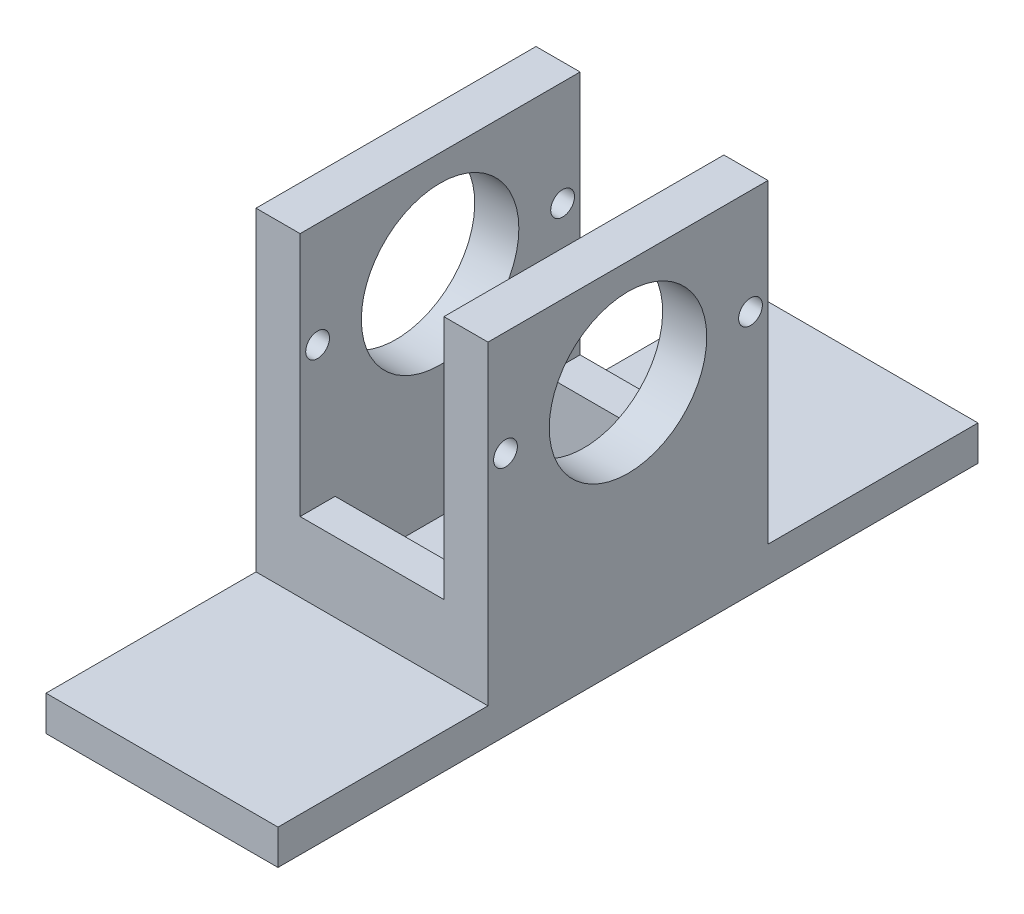
ISO-10303-21;
HEADER;
FILE_DESCRIPTION(('STEP AP214'),'2;1');
FILE_NAME('part.step','',(''),(''),'','','');
FILE_SCHEMA(('AUTOMOTIVE_DESIGN { 1 0 10303 214 1 1 1 1 }'));
ENDSEC;
DATA;
#1=APPLICATION_CONTEXT('core data for automotive mechanical design processes');
#2=APPLICATION_PROTOCOL_DEFINITION('international standard','automotive_design',2000,#1);
#3=PRODUCT_CONTEXT('',#1,'mechanical');
#4=PRODUCT('Part','Part','',(#3));
#5=PRODUCT_RELATED_PRODUCT_CATEGORY('part','',(#4));
#6=PRODUCT_DEFINITION_FORMATION('','',#4);
#7=PRODUCT_DEFINITION_CONTEXT('part definition',#1,'design');
#8=PRODUCT_DEFINITION('design','',#6,#7);
#9=PRODUCT_DEFINITION_SHAPE('','',#8);
#10=(LENGTH_UNIT() NAMED_UNIT(*) SI_UNIT(.MILLI.,.METRE.));
#11=(NAMED_UNIT(*) PLANE_ANGLE_UNIT() SI_UNIT($,.RADIAN.));
#12=(NAMED_UNIT(*) SI_UNIT($,.STERADIAN.) SOLID_ANGLE_UNIT());
#13=UNCERTAINTY_MEASURE_WITH_UNIT(LENGTH_MEASURE(1.E-05),#10,'distance_accuracy_value','');
#14=(GEOMETRIC_REPRESENTATION_CONTEXT(3) GLOBAL_UNCERTAINTY_ASSIGNED_CONTEXT((#13)) GLOBAL_UNIT_ASSIGNED_CONTEXT((#10,
#11,#12)) REPRESENTATION_CONTEXT('',''));
#15=CARTESIAN_POINT('',(0.,0.,0.));
#16=DIRECTION('',(0.,0.,1.));
#17=DIRECTION('',(1.,0.,0.));
#18=AXIS2_PLACEMENT_3D('',#15,#16,#17);
#19=CARTESIAN_POINT('',(13.0429,6.35,25.4));
#20=DIRECTION('',(1.,0.,0.));
#21=DIRECTION('',(0.,1.,0.));
#22=AXIS2_PLACEMENT_3D('',#19,#20,#21);
#23=PLANE('',#22);
#24=CARTESIAN_POINT('',(13.0429,44.45,0.));
#25=DIRECTION('',(1.,0.,0.));
#26=DIRECTION('',(0.,1.,0.));
#27=AXIS2_PLACEMENT_3D('',#24,#25,#26);
#28=CIRCLE('',#27,14.2875);
#29=CARTESIAN_POINT('',(13.0429,58.7375,0.));
#30=VERTEX_POINT('',#29);
#31=EDGE_CURVE('E243',#30,#30,#28,.T.);
#32=ORIENTED_EDGE('',*,*,#31,.T.);
#33=EDGE_LOOP('',(#32));
#34=FACE_BOUND('',#33,.T.);
#35=CARTESIAN_POINT('',(13.0429,44.45,-22.225));
#36=DIRECTION('',(1.,0.,0.));
#37=DIRECTION('',(0.,1.,0.));
#38=AXIS2_PLACEMENT_3D('',#35,#36,#37);
#39=CIRCLE('',#38,2.159);
#40=CARTESIAN_POINT('',(13.0429,46.609,-22.225));
#41=VERTEX_POINT('',#40);
#42=EDGE_CURVE('E250',#41,#41,#39,.T.);
#43=ORIENTED_EDGE('',*,*,#42,.T.);
#44=EDGE_LOOP('',(#43));
#45=FACE_BOUND('',#44,.T.);
#46=CARTESIAN_POINT('',(13.0429,44.45,22.225));
#47=DIRECTION('',(1.,0.,0.));
#48=DIRECTION('',(0.,1.,0.));
#49=AXIS2_PLACEMENT_3D('',#46,#47,#48);
#50=CIRCLE('',#49,2.159);
#51=CARTESIAN_POINT('',(13.0429,46.609,22.225));
#52=VERTEX_POINT('',#51);
#53=EDGE_CURVE('E257',#52,#52,#50,.T.);
#54=ORIENTED_EDGE('',*,*,#53,.T.);
#55=EDGE_LOOP('',(#54));
#56=FACE_BOUND('',#55,.T.);
#57=DIRECTION('',(0.,0.,1.));
#58=VECTOR('',#57,1.);
#59=CARTESIAN_POINT('',(13.0429,19.05,19.05));
#60=LINE('',#59,#58);
#61=CARTESIAN_POINT('',(13.0429,19.05,19.05));
#62=VERTEX_POINT('',#61);
#63=CARTESIAN_POINT('',(13.0429,19.05,25.4));
#64=VERTEX_POINT('',#63);
#65=EDGE_CURVE('E169',#62,#64,#60,.T.);
#66=ORIENTED_EDGE('',*,*,#65,.T.);
#67=DIRECTION('',(0.,-1.,0.));
#68=VECTOR('',#67,1.);
#69=CARTESIAN_POINT('',(13.0429,6.35,25.4));
#70=LINE('',#69,#68);
#71=CARTESIAN_POINT('',(13.0429,63.5,25.4));
#72=VERTEX_POINT('',#71);
#73=EDGE_CURVE('E272',#72,#64,#70,.T.);
#74=ORIENTED_EDGE('',*,*,#73,.F.);
#75=DIRECTION('',(0.,0.,-1.));
#76=VECTOR('',#75,1.);
#77=CARTESIAN_POINT('',(13.0429,63.5,25.4));
#78=LINE('',#77,#76);
#79=CARTESIAN_POINT('',(13.0429,63.5,-25.4));
#80=VERTEX_POINT('',#79);
#81=EDGE_CURVE('E298',#72,#80,#78,.T.);
#82=ORIENTED_EDGE('',*,*,#81,.T.);
#83=DIRECTION('',(0.,-1.,0.));
#84=VECTOR('',#83,1.);
#85=CARTESIAN_POINT('',(13.0429,6.35,-25.4));
#86=LINE('',#85,#84);
#87=CARTESIAN_POINT('',(13.0429,19.05,-25.4));
#88=VERTEX_POINT('',#87);
#89=EDGE_CURVE('E285',#80,#88,#86,.T.);
#90=ORIENTED_EDGE('',*,*,#89,.T.);
#91=DIRECTION('',(0.,0.,-1.));
#92=VECTOR('',#91,1.);
#93=CARTESIAN_POINT('',(13.0429,19.05,-19.05));
#94=LINE('',#93,#92);
#95=CARTESIAN_POINT('',(13.0429,19.05,-19.05));
#96=VERTEX_POINT('',#95);
#97=EDGE_CURVE('E67',#96,#88,#94,.T.);
#98=ORIENTED_EDGE('',*,*,#97,.F.);
#99=DIRECTION('',(0.,-1.,0.));
#100=VECTOR('',#99,1.);
#101=CARTESIAN_POINT('',(13.0429,6.35,-19.05));
#102=LINE('',#101,#100);
#103=CARTESIAN_POINT('',(13.0429,6.35,-19.05));
#104=VERTEX_POINT('',#103);
#105=EDGE_CURVE('E184',#96,#104,#102,.T.);
#106=ORIENTED_EDGE('',*,*,#105,.T.);
#107=DIRECTION('',(0.,0.,-1.));
#108=VECTOR('',#107,1.);
#109=CARTESIAN_POINT('',(13.0429,6.35,25.4));
#110=LINE('',#109,#108);
#111=CARTESIAN_POINT('',(13.0429,6.35,19.05));
#112=VERTEX_POINT('',#111);
#113=EDGE_CURVE('E176',#112,#104,#110,.T.);
#114=ORIENTED_EDGE('',*,*,#113,.F.);
#115=DIRECTION('',(0.,-1.,0.));
#116=VECTOR('',#115,1.);
#117=CARTESIAN_POINT('',(13.0429,6.35,19.05));
#118=LINE('',#117,#116);
#119=EDGE_CURVE('E161',#62,#112,#118,.T.);
#120=ORIENTED_EDGE('',*,*,#119,.F.);
#121=EDGE_LOOP('',(#66,#74,#82,#90,#98,#106,#114,#120));
#122=FACE_BOUND('',#121,.T.);
#123=ADVANCED_FACE('F44',(#34,#45,#56,#122),#23,.F.);
#124=CARTESIAN_POINT('',(-13.0429,6.35,25.4));
#125=DIRECTION('',(0.,-1.,0.));
#126=DIRECTION('',(1.,0.,0.));
#127=AXIS2_PLACEMENT_3D('',#124,#125,#126);
#128=PLANE('',#127);
#129=DIRECTION('',(-1.,0.,0.));
#130=VECTOR('',#129,1.);
#131=CARTESIAN_POINT('',(0.,6.35,25.4));
#132=LINE('',#131,#130);
#133=CARTESIAN_POINT('',(21.0439,6.35,25.4));
#134=VERTEX_POINT('',#133);
#135=CARTESIAN_POINT('',(-21.0439,6.34999999999999,25.4));
#136=VERTEX_POINT('',#135);
#137=EDGE_CURVE('E231',#134,#136,#132,.T.);
#138=ORIENTED_EDGE('',*,*,#137,.T.);
#139=DIRECTION('',(0.,0.,1.));
#140=VECTOR('',#139,1.);
#141=CARTESIAN_POINT('',(-21.0439,6.34999999999999,63.5));
#142=LINE('',#141,#140);
#143=CARTESIAN_POINT('',(-21.0439,6.34999999999999,63.5));
#144=VERTEX_POINT('',#143);
#145=EDGE_CURVE('E212',#136,#144,#142,.T.);
#146=ORIENTED_EDGE('',*,*,#145,.T.);
#147=DIRECTION('',(1.,0.,0.));
#148=VECTOR('',#147,1.);
#149=CARTESIAN_POINT('',(21.0439,6.34999999999999,63.5));
#150=LINE('',#149,#148);
#151=CARTESIAN_POINT('',(21.0439,6.34999999999999,63.5));
#152=VERTEX_POINT('',#151);
#153=EDGE_CURVE('E209',#144,#152,#150,.T.);
#154=ORIENTED_EDGE('',*,*,#153,.T.);
#155=DIRECTION('',(0.,0.,1.));
#156=VECTOR('',#155,1.);
#157=CARTESIAN_POINT('',(21.0439,6.34999999999999,63.5));
#158=LINE('',#157,#156);
#159=EDGE_CURVE('E204',#134,#152,#158,.T.);
#160=ORIENTED_EDGE('',*,*,#159,.F.);
#161=EDGE_LOOP('',(#138,#146,#154,#160));
#162=FACE_BOUND('',#161,.T.);
#163=ADVANCED_FACE('F338',(#162),#128,.F.);
#164=CARTESIAN_POINT('',(-13.0429,63.5,25.4));
#165=DIRECTION('',(-1.,0.,0.));
#166=DIRECTION('',(0.,-1.,0.));
#167=AXIS2_PLACEMENT_3D('',#164,#165,#166);
#168=PLANE('',#167);
#169=CARTESIAN_POINT('',(-13.0429,44.45,0.));
#170=DIRECTION('',(-1.,0.,0.));
#171=DIRECTION('',(0.,-1.,0.));
#172=AXIS2_PLACEMENT_3D('',#169,#170,#171);
#173=CIRCLE('',#172,14.2875);
#174=CARTESIAN_POINT('',(-13.0429,30.1625,0.));
#175=VERTEX_POINT('',#174);
#176=EDGE_CURVE('E242',#175,#175,#173,.T.);
#177=ORIENTED_EDGE('',*,*,#176,.T.);
#178=EDGE_LOOP('',(#177));
#179=FACE_BOUND('',#178,.T.);
#180=CARTESIAN_POINT('',(-13.0429,44.45,-22.225));
#181=DIRECTION('',(-1.,0.,0.));
#182=DIRECTION('',(0.,-1.,0.));
#183=AXIS2_PLACEMENT_3D('',#180,#181,#182);
#184=CIRCLE('',#183,2.159);
#185=CARTESIAN_POINT('',(-13.0429,42.291,-22.225));
#186=VERTEX_POINT('',#185);
#187=EDGE_CURVE('E249',#186,#186,#184,.T.);
#188=ORIENTED_EDGE('',*,*,#187,.T.);
#189=EDGE_LOOP('',(#188));
#190=FACE_BOUND('',#189,.T.);
#191=CARTESIAN_POINT('',(-13.0429,44.45,22.225));
#192=DIRECTION('',(-1.,0.,0.));
#193=DIRECTION('',(0.,-1.,0.));
#194=AXIS2_PLACEMENT_3D('',#191,#192,#193);
#195=CIRCLE('',#194,2.159);
#196=CARTESIAN_POINT('',(-13.0429,42.291,22.225));
#197=VERTEX_POINT('',#196);
#198=EDGE_CURVE('E256',#197,#197,#195,.T.);
#199=ORIENTED_EDGE('',*,*,#198,.T.);
#200=EDGE_LOOP('',(#199));
#201=FACE_BOUND('',#200,.T.);
#202=DIRECTION('',(0.,0.,1.));
#203=VECTOR('',#202,1.);
#204=CARTESIAN_POINT('',(-13.0429,19.05,19.05));
#205=LINE('',#204,#203);
#206=CARTESIAN_POINT('',(-13.0429,19.05,19.05));
#207=VERTEX_POINT('',#206);
#208=CARTESIAN_POINT('',(-13.0429,19.05,25.4));
#209=VERTEX_POINT('',#208);
#210=EDGE_CURVE('E172',#207,#209,#205,.T.);
#211=ORIENTED_EDGE('',*,*,#210,.F.);
#212=DIRECTION('',(0.,1.,0.));
#213=VECTOR('',#212,1.);
#214=CARTESIAN_POINT('',(-13.0429,6.35,19.05));
#215=LINE('',#214,#213);
#216=CARTESIAN_POINT('',(-13.0429,6.35,19.05));
#217=VERTEX_POINT('',#216);
#218=EDGE_CURVE('E164',#217,#207,#215,.T.);
#219=ORIENTED_EDGE('',*,*,#218,.F.);
#220=DIRECTION('',(0.,0.,-1.));
#221=VECTOR('',#220,1.);
#222=CARTESIAN_POINT('',(-13.0429,6.35,25.4));
#223=LINE('',#222,#221);
#224=CARTESIAN_POINT('',(-13.0429,6.35,-19.05));
#225=VERTEX_POINT('',#224);
#226=EDGE_CURVE('E295',#217,#225,#223,.T.);
#227=ORIENTED_EDGE('',*,*,#226,.T.);
#228=DIRECTION('',(0.,1.,0.));
#229=VECTOR('',#228,1.);
#230=CARTESIAN_POINT('',(-13.0429,6.35,-19.05));
#231=LINE('',#230,#229);
#232=CARTESIAN_POINT('',(-13.0429,19.05,-19.05));
#233=VERTEX_POINT('',#232);
#234=EDGE_CURVE('E189',#225,#233,#231,.T.);
#235=ORIENTED_EDGE('',*,*,#234,.T.);
#236=DIRECTION('',(0.,0.,-1.));
#237=VECTOR('',#236,1.);
#238=CARTESIAN_POINT('',(-13.0429,19.05,-19.05));
#239=LINE('',#238,#237);
#240=CARTESIAN_POINT('',(-13.0429,19.05,-25.4));
#241=VERTEX_POINT('',#240);
#242=EDGE_CURVE('E194',#233,#241,#239,.T.);
#243=ORIENTED_EDGE('',*,*,#242,.T.);
#244=DIRECTION('',(0.,1.,0.));
#245=VECTOR('',#244,1.);
#246=CARTESIAN_POINT('',(-13.0429,63.5,-25.4));
#247=LINE('',#246,#245);
#248=CARTESIAN_POINT('',(-13.0429,63.5,-25.4));
#249=VERTEX_POINT('',#248);
#250=EDGE_CURVE('E287',#241,#249,#247,.T.);
#251=ORIENTED_EDGE('',*,*,#250,.T.);
#252=DIRECTION('',(0.,0.,-1.));
#253=VECTOR('',#252,1.);
#254=CARTESIAN_POINT('',(-13.0429,63.5,25.4));
#255=LINE('',#254,#253);
#256=CARTESIAN_POINT('',(-13.0429,63.5,25.4));
#257=VERTEX_POINT('',#256);
#258=EDGE_CURVE('E292',#257,#249,#255,.T.);
#259=ORIENTED_EDGE('',*,*,#258,.F.);
#260=DIRECTION('',(0.,1.,0.));
#261=VECTOR('',#260,1.);
#262=CARTESIAN_POINT('',(-13.0429,63.5,25.4));
#263=LINE('',#262,#261);
#264=EDGE_CURVE('E274',#209,#257,#263,.T.);
#265=ORIENTED_EDGE('',*,*,#264,.F.);
#266=EDGE_LOOP('',(#211,#219,#227,#235,#243,#251,#259,#265));
#267=FACE_BOUND('',#266,.T.);
#268=ADVANCED_FACE('F313',(#179,#190,#201,#267),#168,.F.);
#269=DIRECTION('',(-1.,0.,0.));
#270=VECTOR('',#269,1.);
#271=CARTESIAN_POINT('',(0.,6.35,-25.4));
#272=LINE('',#271,#270);
#273=CARTESIAN_POINT('',(21.0439,6.34999999999999,-25.4));
#274=VERTEX_POINT('',#273);
#275=CARTESIAN_POINT('',(-21.0439,6.35,-25.4));
#276=VERTEX_POINT('',#275);
#277=EDGE_CURVE('E13',#274,#276,#272,.T.);
#278=ORIENTED_EDGE('',*,*,#277,.F.);
#279=CARTESIAN_POINT('',(21.0439,6.34999999999999,-63.5));
#280=VERTEX_POINT('',#279);
#281=EDGE_CURVE('E206',#280,#274,#158,.T.);
#282=ORIENTED_EDGE('',*,*,#281,.F.);
#283=DIRECTION('',(1.,0.,0.));
#284=VECTOR('',#283,1.);
#285=CARTESIAN_POINT('',(21.0439,6.34999999999999,-63.5));
#286=LINE('',#285,#284);
#287=CARTESIAN_POINT('',(-21.0439,6.35000000000005,-63.5));
#288=VERTEX_POINT('',#287);
#289=EDGE_CURVE('E201',#288,#280,#286,.T.);
#290=ORIENTED_EDGE('',*,*,#289,.F.);
#291=EDGE_CURVE('E229',#288,#276,#142,.T.);
#292=ORIENTED_EDGE('',*,*,#291,.T.);
#293=EDGE_LOOP('',(#278,#282,#290,#292));
#294=FACE_BOUND('',#293,.T.);
#295=ADVANCED_FACE('F346',(#294),#128,.F.);
#296=CARTESIAN_POINT('',(0.,0.,25.4));
#297=DIRECTION('',(0.,0.,-1.));
#298=DIRECTION('',(-1.,0.,0.));
#299=AXIS2_PLACEMENT_3D('',#296,#297,#298);
#300=PLANE('',#299);
#301=DIRECTION('',(0.,-1.,0.));
#302=VECTOR('',#301,1.);
#303=CARTESIAN_POINT('',(-21.0439,0.,25.4));
#304=LINE('',#303,#302);
#305=CARTESIAN_POINT('',(-21.0439,63.5,25.4));
#306=VERTEX_POINT('',#305);
#307=EDGE_CURVE('E264',#306,#136,#304,.T.);
#308=ORIENTED_EDGE('',*,*,#307,.T.);
#309=ORIENTED_EDGE('',*,*,#137,.F.);
#310=DIRECTION('',(0.,1.,0.));
#311=VECTOR('',#310,1.);
#312=CARTESIAN_POINT('',(21.0439,0.,25.4));
#313=LINE('',#312,#311);
#314=CARTESIAN_POINT('',(21.0439,63.5,25.4));
#315=VERTEX_POINT('',#314);
#316=EDGE_CURVE('E267',#134,#315,#313,.T.);
#317=ORIENTED_EDGE('',*,*,#316,.T.);
#318=DIRECTION('',(-1.,0.,0.));
#319=VECTOR('',#318,1.);
#320=CARTESIAN_POINT('',(13.0429,63.5,25.4));
#321=LINE('',#320,#319);
#322=EDGE_CURVE('E270',#315,#72,#321,.T.);
#323=ORIENTED_EDGE('',*,*,#322,.T.);
#324=ORIENTED_EDGE('',*,*,#73,.T.);
#325=DIRECTION('',(1.,0.,0.));
#326=VECTOR('',#325,1.);
#327=CARTESIAN_POINT('',(13.0429,19.05,25.4));
#328=LINE('',#327,#326);
#329=EDGE_CURVE('E59',#209,#64,#328,.T.);
#330=ORIENTED_EDGE('',*,*,#329,.F.);
#331=ORIENTED_EDGE('',*,*,#264,.T.);
#332=DIRECTION('',(-1.,0.,0.));
#333=VECTOR('',#332,1.);
#334=CARTESIAN_POINT('',(-21.0439,63.5,25.4));
#335=LINE('',#334,#333);
#336=EDGE_CURVE('E276',#257,#306,#335,.T.);
#337=ORIENTED_EDGE('',*,*,#336,.T.);
#338=EDGE_LOOP('',(#308,#309,#317,#323,#324,#330,#331,#337));
#339=FACE_BOUND('',#338,.T.);
#340=ADVANCED_FACE('F384',(#339),#300,.F.);
#341=CARTESIAN_POINT('',(0.,0.,-25.4));
#342=DIRECTION('',(0.,0.,-1.));
#343=DIRECTION('',(-1.,0.,0.));
#344=AXIS2_PLACEMENT_3D('',#341,#342,#343);
#345=PLANE('',#344);
#346=ORIENTED_EDGE('',*,*,#250,.F.);
#347=DIRECTION('',(1.,0.,0.));
#348=VECTOR('',#347,1.);
#349=CARTESIAN_POINT('',(13.0429,19.05,-25.4));
#350=LINE('',#349,#348);
#351=EDGE_CURVE('E182',#241,#88,#350,.T.);
#352=ORIENTED_EDGE('',*,*,#351,.T.);
#353=ORIENTED_EDGE('',*,*,#89,.F.);
#354=DIRECTION('',(-1.,0.,0.));
#355=VECTOR('',#354,1.);
#356=CARTESIAN_POINT('',(13.0429,63.5,-25.4));
#357=LINE('',#356,#355);
#358=CARTESIAN_POINT('',(21.0439,63.5,-25.4));
#359=VERTEX_POINT('',#358);
#360=EDGE_CURVE('E283',#359,#80,#357,.T.);
#361=ORIENTED_EDGE('',*,*,#360,.F.);
#362=DIRECTION('',(0.,1.,0.));
#363=VECTOR('',#362,1.);
#364=CARTESIAN_POINT('',(21.0439,0.,-25.4));
#365=LINE('',#364,#363);
#366=EDGE_CURVE('E281',#274,#359,#365,.T.);
#367=ORIENTED_EDGE('',*,*,#366,.F.);
#368=ORIENTED_EDGE('',*,*,#277,.T.);
#369=DIRECTION('',(0.,-1.,0.));
#370=VECTOR('',#369,1.);
#371=CARTESIAN_POINT('',(-21.0439,0.,-25.4));
#372=LINE('',#371,#370);
#373=CARTESIAN_POINT('',(-21.0439,63.5,-25.4));
#374=VERTEX_POINT('',#373);
#375=EDGE_CURVE('E263',#374,#276,#372,.T.);
#376=ORIENTED_EDGE('',*,*,#375,.F.);
#377=DIRECTION('',(-1.,0.,0.));
#378=VECTOR('',#377,1.);
#379=CARTESIAN_POINT('',(-21.0439,63.5,-25.4));
#380=LINE('',#379,#378);
#381=EDGE_CURVE('E268',#249,#374,#380,.T.);
#382=ORIENTED_EDGE('',*,*,#381,.F.);
#383=EDGE_LOOP('',(#346,#352,#353,#361,#367,#368,#376,#382));
#384=FACE_BOUND('',#383,.T.);
#385=ADVANCED_FACE('F364',(#384),#345,.T.);
#386=CARTESIAN_POINT('',(-21.0439,0.,25.4));
#387=DIRECTION('',(1.,0.,0.));
#388=DIRECTION('',(0.,1.,0.));
#389=AXIS2_PLACEMENT_3D('',#386,#387,#388);
#390=PLANE('',#389);
#391=DIRECTION('',(0.,0.,-1.));
#392=VECTOR('',#391,1.);
#393=CARTESIAN_POINT('',(-21.0439,0.,25.4));
#394=LINE('',#393,#392);
#395=CARTESIAN_POINT('',(-21.0439,0.,63.5));
#396=VERTEX_POINT('',#395);
#397=CARTESIAN_POINT('',(-21.0439,0.,-63.5));
#398=VERTEX_POINT('',#397);
#399=EDGE_CURVE('E52',#396,#398,#394,.T.);
#400=ORIENTED_EDGE('',*,*,#399,.F.);
#401=DIRECTION('',(0.,-1.,0.));
#402=VECTOR('',#401,1.);
#403=CARTESIAN_POINT('',(-21.0439,140.142312592466,63.5));
#404=LINE('',#403,#402);
#405=EDGE_CURVE('E218',#144,#396,#404,.T.);
#406=ORIENTED_EDGE('',*,*,#405,.F.);
#407=ORIENTED_EDGE('',*,*,#145,.F.);
#408=ORIENTED_EDGE('',*,*,#307,.F.);
#409=DIRECTION('',(0.,0.,-1.));
#410=VECTOR('',#409,1.);
#411=CARTESIAN_POINT('',(-21.0439,63.5,25.4));
#412=LINE('',#411,#410);
#413=EDGE_CURVE('E278',#306,#374,#412,.T.);
#414=ORIENTED_EDGE('',*,*,#413,.T.);
#415=ORIENTED_EDGE('',*,*,#375,.T.);
#416=ORIENTED_EDGE('',*,*,#291,.F.);
#417=DIRECTION('',(0.,-1.,0.));
#418=VECTOR('',#417,1.);
#419=CARTESIAN_POINT('',(-21.0439,140.142312592466,-63.5));
#420=LINE('',#419,#418);
#421=EDGE_CURVE('E224',#288,#398,#420,.T.);
#422=ORIENTED_EDGE('',*,*,#421,.T.);
#423=EDGE_LOOP('',(#400,#406,#407,#408,#414,#415,#416,#422));
#424=FACE_BOUND('',#423,.T.);
#425=CARTESIAN_POINT('',(-21.0439,44.45,0.));
#426=DIRECTION('',(1.,0.,0.));
#427=DIRECTION('',(0.,1.,0.));
#428=AXIS2_PLACEMENT_3D('',#425,#426,#427);
#429=CIRCLE('',#428,14.2875);
#430=CARTESIAN_POINT('',(-21.0439,58.7375,0.));
#431=VERTEX_POINT('',#430);
#432=EDGE_CURVE('E237',#431,#431,#429,.T.);
#433=ORIENTED_EDGE('',*,*,#432,.T.);
#434=EDGE_LOOP('',(#433));
#435=FACE_BOUND('',#434,.T.);
#436=CARTESIAN_POINT('',(-21.0439,44.45,-22.225));
#437=DIRECTION('',(1.,0.,0.));
#438=DIRECTION('',(0.,1.,0.));
#439=AXIS2_PLACEMENT_3D('',#436,#437,#438);
#440=CIRCLE('',#439,2.159);
#441=CARTESIAN_POINT('',(-21.0439,46.609,-22.225));
#442=VERTEX_POINT('',#441);
#443=EDGE_CURVE('E234',#442,#442,#440,.T.);
#444=ORIENTED_EDGE('',*,*,#443,.T.);
#445=EDGE_LOOP('',(#444));
#446=FACE_BOUND('',#445,.T.);
#447=CARTESIAN_POINT('',(-21.0439,44.45,22.225));
#448=DIRECTION('',(1.,0.,0.));
#449=DIRECTION('',(0.,1.,0.));
#450=AXIS2_PLACEMENT_3D('',#447,#448,#449);
#451=CIRCLE('',#450,2.159);
#452=CARTESIAN_POINT('',(-21.0439,46.609,22.225));
#453=VERTEX_POINT('',#452);
#454=EDGE_CURVE('E233',#453,#453,#451,.T.);
#455=ORIENTED_EDGE('',*,*,#454,.T.);
#456=EDGE_LOOP('',(#455));
#457=FACE_BOUND('',#456,.T.);
#458=ADVANCED_FACE('F46',(#424,#435,#446,#457),#390,.F.);
#459=CARTESIAN_POINT('',(-21.0439,0.,25.4));
#460=DIRECTION('',(0.,1.,0.));
#461=DIRECTION('',(-1.,0.,0.));
#462=AXIS2_PLACEMENT_3D('',#459,#460,#461);
#463=PLANE('',#462);
#464=ORIENTED_EDGE('',*,*,#399,.T.);
#465=DIRECTION('',(-1.,0.,0.));
#466=VECTOR('',#465,1.);
#467=CARTESIAN_POINT('',(21.0439,0.,-63.5));
#468=LINE('',#467,#466);
#469=CARTESIAN_POINT('',(21.0439,0.,-63.5));
#470=VERTEX_POINT('',#469);
#471=EDGE_CURVE('E215',#470,#398,#468,.T.);
#472=ORIENTED_EDGE('',*,*,#471,.F.);
#473=DIRECTION('',(0.,0.,-1.));
#474=VECTOR('',#473,1.);
#475=CARTESIAN_POINT('',(21.0439,0.,25.4));
#476=LINE('',#475,#474);
#477=CARTESIAN_POINT('',(21.0439,0.,63.5));
#478=VERTEX_POINT('',#477);
#479=EDGE_CURVE('E304',#478,#470,#476,.T.);
#480=ORIENTED_EDGE('',*,*,#479,.F.);
#481=DIRECTION('',(-1.,0.,0.));
#482=VECTOR('',#481,1.);
#483=CARTESIAN_POINT('',(21.0439,0.,63.5));
#484=LINE('',#483,#482);
#485=EDGE_CURVE('E198',#478,#396,#484,.T.);
#486=ORIENTED_EDGE('',*,*,#485,.T.);
#487=EDGE_LOOP('',(#464,#472,#480,#486));
#488=FACE_BOUND('',#487,.T.);
#489=ADVANCED_FACE('F357',(#488),#463,.F.);
#490=CARTESIAN_POINT('',(21.0439,0.,25.4));
#491=DIRECTION('',(-1.,0.,0.));
#492=DIRECTION('',(0.,-1.,0.));
#493=AXIS2_PLACEMENT_3D('',#490,#491,#492);
#494=PLANE('',#493);
#495=ORIENTED_EDGE('',*,*,#479,.T.);
#496=DIRECTION('',(0.,-1.,0.));
#497=VECTOR('',#496,1.);
#498=CARTESIAN_POINT('',(21.0439,140.142312592466,-63.5));
#499=LINE('',#498,#497);
#500=EDGE_CURVE('E221',#280,#470,#499,.T.);
#501=ORIENTED_EDGE('',*,*,#500,.F.);
#502=ORIENTED_EDGE('',*,*,#281,.T.);
#503=ORIENTED_EDGE('',*,*,#366,.T.);
#504=DIRECTION('',(0.,0.,-1.));
#505=VECTOR('',#504,1.);
#506=CARTESIAN_POINT('',(21.0439,63.5,25.4));
#507=LINE('',#506,#505);
#508=EDGE_CURVE('E301',#315,#359,#507,.T.);
#509=ORIENTED_EDGE('',*,*,#508,.F.);
#510=ORIENTED_EDGE('',*,*,#316,.F.);
#511=ORIENTED_EDGE('',*,*,#159,.T.);
#512=DIRECTION('',(0.,-1.,0.));
#513=VECTOR('',#512,1.);
#514=CARTESIAN_POINT('',(21.0439,140.142312592466,63.5));
#515=LINE('',#514,#513);
#516=EDGE_CURVE('E205',#152,#478,#515,.T.);
#517=ORIENTED_EDGE('',*,*,#516,.T.);
#518=EDGE_LOOP('',(#495,#501,#502,#503,#509,#510,#511,#517));
#519=FACE_BOUND('',#518,.T.);
#520=CARTESIAN_POINT('',(21.0439,44.45,0.));
#521=DIRECTION('',(-1.,0.,0.));
#522=DIRECTION('',(0.,-1.,0.));
#523=AXIS2_PLACEMENT_3D('',#520,#521,#522);
#524=CIRCLE('',#523,14.2875);
#525=CARTESIAN_POINT('',(21.0439,30.1625,0.));
#526=VERTEX_POINT('',#525);
#527=EDGE_CURVE('E246',#526,#526,#524,.T.);
#528=ORIENTED_EDGE('',*,*,#527,.T.);
#529=EDGE_LOOP('',(#528));
#530=FACE_BOUND('',#529,.T.);
#531=CARTESIAN_POINT('',(21.0439,44.45,-22.225));
#532=DIRECTION('',(-1.,0.,0.));
#533=DIRECTION('',(0.,-1.,0.));
#534=AXIS2_PLACEMENT_3D('',#531,#532,#533);
#535=CIRCLE('',#534,2.159);
#536=CARTESIAN_POINT('',(21.0439,42.291,-22.225));
#537=VERTEX_POINT('',#536);
#538=EDGE_CURVE('E253',#537,#537,#535,.T.);
#539=ORIENTED_EDGE('',*,*,#538,.T.);
#540=EDGE_LOOP('',(#539));
#541=FACE_BOUND('',#540,.T.);
#542=CARTESIAN_POINT('',(21.0439,44.45,22.225));
#543=DIRECTION('',(-1.,0.,0.));
#544=DIRECTION('',(0.,-1.,0.));
#545=AXIS2_PLACEMENT_3D('',#542,#543,#544);
#546=CIRCLE('',#545,2.159);
#547=CARTESIAN_POINT('',(21.0439,42.291,22.225));
#548=VERTEX_POINT('',#547);
#549=EDGE_CURVE('E260',#548,#548,#546,.T.);
#550=ORIENTED_EDGE('',*,*,#549,.T.);
#551=EDGE_LOOP('',(#550));
#552=FACE_BOUND('',#551,.T.);
#553=ADVANCED_FACE('F354',(#519,#530,#541,#552),#494,.F.);
#554=CARTESIAN_POINT('',(13.0429,63.5,25.4));
#555=DIRECTION('',(0.,-1.,0.));
#556=DIRECTION('',(1.,0.,0.));
#557=AXIS2_PLACEMENT_3D('',#554,#555,#556);
#558=PLANE('',#557);
#559=ORIENTED_EDGE('',*,*,#360,.T.);
#560=ORIENTED_EDGE('',*,*,#81,.F.);
#561=ORIENTED_EDGE('',*,*,#322,.F.);
#562=ORIENTED_EDGE('',*,*,#508,.T.);
#563=EDGE_LOOP('',(#559,#560,#561,#562));
#564=FACE_BOUND('',#563,.T.);
#565=ADVANCED_FACE('F351',(#564),#558,.F.);
#566=ORIENTED_EDGE('',*,*,#226,.F.);
#567=DIRECTION('',(-1.,0.,0.));
#568=VECTOR('',#567,1.);
#569=CARTESIAN_POINT('',(13.0429,6.35,19.05));
#570=LINE('',#569,#568);
#571=EDGE_CURVE('E173',#112,#217,#570,.T.);
#572=ORIENTED_EDGE('',*,*,#571,.F.);
#573=ORIENTED_EDGE('',*,*,#113,.T.);
#574=DIRECTION('',(-1.,0.,0.));
#575=VECTOR('',#574,1.);
#576=CARTESIAN_POINT('',(13.0429,6.35,-19.05));
#577=LINE('',#576,#575);
#578=EDGE_CURVE('E186',#104,#225,#577,.T.);
#579=ORIENTED_EDGE('',*,*,#578,.T.);
#580=EDGE_LOOP('',(#566,#572,#573,#579));
#581=FACE_BOUND('',#580,.T.);
#582=ADVANCED_FACE('F347',(#581),#128,.F.);
#583=CARTESIAN_POINT('',(-21.0439,63.5,25.4));
#584=DIRECTION('',(0.,-1.,0.));
#585=DIRECTION('',(0.,0.,-1.));
#586=AXIS2_PLACEMENT_3D('',#583,#584,#585);
#587=PLANE('',#586);
#588=ORIENTED_EDGE('',*,*,#381,.T.);
#589=ORIENTED_EDGE('',*,*,#413,.F.);
#590=ORIENTED_EDGE('',*,*,#336,.F.);
#591=ORIENTED_EDGE('',*,*,#258,.T.);
#592=EDGE_LOOP('',(#588,#589,#590,#591));
#593=FACE_BOUND('',#592,.T.);
#594=ADVANCED_FACE('F390',(#593),#587,.F.);
#595=CARTESIAN_POINT('',(-21.0439,44.45,0.));
#596=DIRECTION('',(1.,0.,0.));
#597=DIRECTION('',(0.,1.,0.));
#598=AXIS2_PLACEMENT_3D('',#595,#596,#597);
#599=CYLINDRICAL_SURFACE('',#598,14.2875);
#600=ORIENTED_EDGE('',*,*,#432,.F.);
#601=EDGE_LOOP('',(#600));
#602=FACE_BOUND('',#601,.T.);
#603=ORIENTED_EDGE('',*,*,#176,.F.);
#604=EDGE_LOOP('',(#603));
#605=FACE_BOUND('',#604,.T.);
#606=ADVANCED_FACE('F330',(#602,#605),#599,.F.);
#607=CARTESIAN_POINT('',(-21.0439,44.45,-22.225));
#608=DIRECTION('',(1.,0.,0.));
#609=DIRECTION('',(0.,1.,0.));
#610=AXIS2_PLACEMENT_3D('',#607,#608,#609);
#611=CYLINDRICAL_SURFACE('',#610,2.159);
#612=ORIENTED_EDGE('',*,*,#443,.F.);
#613=EDGE_LOOP('',(#612));
#614=FACE_BOUND('',#613,.T.);
#615=ORIENTED_EDGE('',*,*,#187,.F.);
#616=EDGE_LOOP('',(#615));
#617=FACE_BOUND('',#616,.T.);
#618=ADVANCED_FACE('F319',(#614,#617),#611,.F.);
#619=CARTESIAN_POINT('',(-21.0439,44.45,22.225));
#620=DIRECTION('',(1.,0.,0.));
#621=DIRECTION('',(0.,1.,0.));
#622=AXIS2_PLACEMENT_3D('',#619,#620,#621);
#623=CYLINDRICAL_SURFACE('',#622,2.159);
#624=ORIENTED_EDGE('',*,*,#454,.F.);
#625=EDGE_LOOP('',(#624));
#626=FACE_BOUND('',#625,.T.);
#627=ORIENTED_EDGE('',*,*,#198,.F.);
#628=EDGE_LOOP('',(#627));
#629=FACE_BOUND('',#628,.T.);
#630=ADVANCED_FACE('F316',(#626,#629),#623,.F.);
#631=ORIENTED_EDGE('',*,*,#31,.F.);
#632=EDGE_LOOP('',(#631));
#633=FACE_BOUND('',#632,.T.);
#634=ORIENTED_EDGE('',*,*,#527,.F.);
#635=EDGE_LOOP('',(#634));
#636=FACE_BOUND('',#635,.T.);
#637=ADVANCED_FACE('F318',(#633,#636),#599,.F.);
#638=ORIENTED_EDGE('',*,*,#42,.F.);
#639=EDGE_LOOP('',(#638));
#640=FACE_BOUND('',#639,.T.);
#641=ORIENTED_EDGE('',*,*,#538,.F.);
#642=EDGE_LOOP('',(#641));
#643=FACE_BOUND('',#642,.T.);
#644=ADVANCED_FACE('F327',(#640,#643),#611,.F.);
#645=ORIENTED_EDGE('',*,*,#53,.F.);
#646=EDGE_LOOP('',(#645));
#647=FACE_BOUND('',#646,.T.);
#648=ORIENTED_EDGE('',*,*,#549,.F.);
#649=EDGE_LOOP('',(#648));
#650=FACE_BOUND('',#649,.T.);
#651=ADVANCED_FACE('F322',(#647,#650),#623,.F.);
#652=CARTESIAN_POINT('',(21.0439,140.142312592466,-63.5));
#653=DIRECTION('',(0.,0.,1.));
#654=DIRECTION('',(1.,0.,0.));
#655=AXIS2_PLACEMENT_3D('',#652,#653,#654);
#656=PLANE('',#655);
#657=ORIENTED_EDGE('',*,*,#421,.F.);
#658=ORIENTED_EDGE('',*,*,#289,.T.);
#659=ORIENTED_EDGE('',*,*,#500,.T.);
#660=ORIENTED_EDGE('',*,*,#471,.T.);
#661=EDGE_LOOP('',(#657,#658,#659,#660));
#662=FACE_BOUND('',#661,.T.);
#663=ADVANCED_FACE('F335',(#662),#656,.F.);
#664=CARTESIAN_POINT('',(21.0439,140.142312592466,63.5));
#665=DIRECTION('',(0.,0.,1.));
#666=DIRECTION('',(1.,0.,0.));
#667=AXIS2_PLACEMENT_3D('',#664,#665,#666);
#668=PLANE('',#667);
#669=ORIENTED_EDGE('',*,*,#153,.F.);
#670=ORIENTED_EDGE('',*,*,#405,.T.);
#671=ORIENTED_EDGE('',*,*,#485,.F.);
#672=ORIENTED_EDGE('',*,*,#516,.F.);
#673=EDGE_LOOP('',(#669,#670,#671,#672));
#674=FACE_BOUND('',#673,.T.);
#675=ADVANCED_FACE('F381',(#674),#668,.T.);
#676=CARTESIAN_POINT('',(13.0429,19.05,-19.05));
#677=DIRECTION('',(0.,1.,0.));
#678=DIRECTION('',(0.,0.,1.));
#679=AXIS2_PLACEMENT_3D('',#676,#677,#678);
#680=PLANE('',#679);
#681=ORIENTED_EDGE('',*,*,#351,.F.);
#682=ORIENTED_EDGE('',*,*,#242,.F.);
#683=DIRECTION('',(1.,0.,0.));
#684=VECTOR('',#683,1.);
#685=CARTESIAN_POINT('',(13.0429,19.05,-19.05));
#686=LINE('',#685,#684);
#687=EDGE_CURVE('E191',#233,#96,#686,.T.);
#688=ORIENTED_EDGE('',*,*,#687,.T.);
#689=ORIENTED_EDGE('',*,*,#97,.T.);
#690=EDGE_LOOP('',(#681,#682,#688,#689));
#691=FACE_BOUND('',#690,.T.);
#692=ADVANCED_FACE('F416',(#691),#680,.T.);
#693=CARTESIAN_POINT('',(0.,0.,-19.05));
#694=DIRECTION('',(0.,0.,1.));
#695=DIRECTION('',(1.,0.,0.));
#696=AXIS2_PLACEMENT_3D('',#693,#694,#695);
#697=PLANE('',#696);
#698=ORIENTED_EDGE('',*,*,#105,.F.);
#699=ORIENTED_EDGE('',*,*,#687,.F.);
#700=ORIENTED_EDGE('',*,*,#234,.F.);
#701=ORIENTED_EDGE('',*,*,#578,.F.);
#702=EDGE_LOOP('',(#698,#699,#700,#701));
#703=FACE_BOUND('',#702,.T.);
#704=ADVANCED_FACE('F419',(#703),#697,.T.);
#705=CARTESIAN_POINT('',(13.0429,19.05,19.05));
#706=DIRECTION('',(0.,-1.,0.));
#707=DIRECTION('',(0.,0.,-1.));
#708=AXIS2_PLACEMENT_3D('',#705,#706,#707);
#709=PLANE('',#708);
#710=ORIENTED_EDGE('',*,*,#329,.T.);
#711=ORIENTED_EDGE('',*,*,#65,.F.);
#712=DIRECTION('',(1.,0.,0.));
#713=VECTOR('',#712,1.);
#714=CARTESIAN_POINT('',(13.0429,19.05,19.05));
#715=LINE('',#714,#713);
#716=EDGE_CURVE('E157',#207,#62,#715,.T.);
#717=ORIENTED_EDGE('',*,*,#716,.F.);
#718=ORIENTED_EDGE('',*,*,#210,.T.);
#719=EDGE_LOOP('',(#710,#711,#717,#718));
#720=FACE_BOUND('',#719,.T.);
#721=ADVANCED_FACE('F170',(#720),#709,.F.);
#722=CARTESIAN_POINT('',(0.,0.,19.05));
#723=DIRECTION('',(0.,0.,-1.));
#724=DIRECTION('',(1.,0.,0.));
#725=AXIS2_PLACEMENT_3D('',#722,#723,#724);
#726=PLANE('',#725);
#727=ORIENTED_EDGE('',*,*,#119,.T.);
#728=ORIENTED_EDGE('',*,*,#571,.T.);
#729=ORIENTED_EDGE('',*,*,#218,.T.);
#730=ORIENTED_EDGE('',*,*,#716,.T.);
#731=EDGE_LOOP('',(#727,#728,#729,#730));
#732=FACE_BOUND('',#731,.T.);
#733=ADVANCED_FACE('F159',(#732),#726,.T.);
#734=CLOSED_SHELL('',(#123,#163,#268,#295,#340,#385,#458,#489,#553,#565,#582,#594,#606,#618,
#630,#637,#644,#651,#663,#675,#692,#704,#721,#733));
#735=MANIFOLD_SOLID_BREP('B2',#734);
#736=ADVANCED_BREP_SHAPE_REPRESENTATION('',(#18,#735),#14);
#737=SHAPE_DEFINITION_REPRESENTATION(#9,#736);
ENDSEC;
END-ISO-10303-21;
